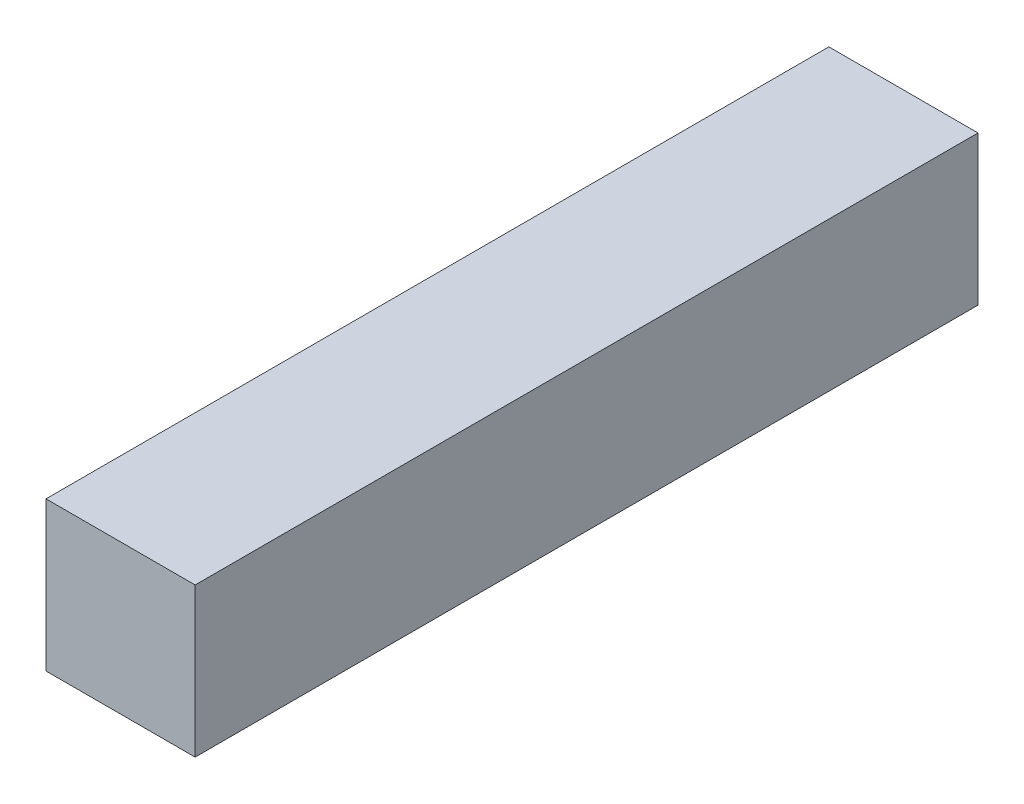
ISO-10303-21;
HEADER;
FILE_DESCRIPTION(('STEP AP214'),'2;1');
FILE_NAME('part.step','',(''),(''),'','','');
FILE_SCHEMA(('AUTOMOTIVE_DESIGN { 1 0 10303 214 1 1 1 1 }'));
ENDSEC;
DATA;
#1=APPLICATION_CONTEXT('core data for automotive mechanical design processes');
#2=APPLICATION_PROTOCOL_DEFINITION('international standard','automotive_design',2000,#1);
#3=PRODUCT_CONTEXT('',#1,'mechanical');
#4=PRODUCT('Part','Part','',(#3));
#5=PRODUCT_RELATED_PRODUCT_CATEGORY('part','',(#4));
#6=PRODUCT_DEFINITION_FORMATION('','',#4);
#7=PRODUCT_DEFINITION_CONTEXT('part definition',#1,'design');
#8=PRODUCT_DEFINITION('design','',#6,#7);
#9=PRODUCT_DEFINITION_SHAPE('','',#8);
#10=(LENGTH_UNIT() NAMED_UNIT(*) SI_UNIT(.MILLI.,.METRE.));
#11=(NAMED_UNIT(*) PLANE_ANGLE_UNIT() SI_UNIT($,.RADIAN.));
#12=(NAMED_UNIT(*) SI_UNIT($,.STERADIAN.) SOLID_ANGLE_UNIT());
#13=UNCERTAINTY_MEASURE_WITH_UNIT(LENGTH_MEASURE(1.E-05),#10,'distance_accuracy_value','');
#14=(GEOMETRIC_REPRESENTATION_CONTEXT(3) GLOBAL_UNCERTAINTY_ASSIGNED_CONTEXT((#13)) GLOBAL_UNIT_ASSIGNED_CONTEXT((#10,
#11,#12)) REPRESENTATION_CONTEXT('',''));
#15=CARTESIAN_POINT('',(0.,0.,0.));
#16=DIRECTION('',(0.,0.,1.));
#17=DIRECTION('',(1.,0.,0.));
#18=AXIS2_PLACEMENT_3D('',#15,#16,#17);
#19=CARTESIAN_POINT('',(2.38125,2.38125,-304.8));
#20=DIRECTION('',(1.,0.,0.));
#21=DIRECTION('',(0.,1.,0.));
#22=AXIS2_PLACEMENT_3D('',#19,#20,#21);
#23=PLANE('',#22);
#24=DIRECTION('',(0.,1.,0.));
#25=VECTOR('',#24,1.);
#26=CARTESIAN_POINT('',(2.38125,-2.38125,-304.8));
#27=LINE('',#26,#25);
#28=CARTESIAN_POINT('',(2.38125,-2.38125,-304.8));
#29=VERTEX_POINT('',#28);
#30=CARTESIAN_POINT('',(2.38125,2.38125,-304.8));
#31=VERTEX_POINT('',#30);
#32=EDGE_CURVE('E55',#29,#31,#27,.T.);
#33=ORIENTED_EDGE('',*,*,#32,.T.);
#34=DIRECTION('',(0.,0.,1.));
#35=VECTOR('',#34,1.);
#36=CARTESIAN_POINT('',(2.38125,2.38125,-304.8));
#37=LINE('',#36,#35);
#38=CARTESIAN_POINT('',(2.38125,2.38125,-279.8));
#39=VERTEX_POINT('',#38);
#40=EDGE_CURVE('E68',#39,#31,#37,.F.);
#41=ORIENTED_EDGE('',*,*,#40,.F.);
#42=DIRECTION('',(0.,1.,0.));
#43=VECTOR('',#42,1.);
#44=CARTESIAN_POINT('',(2.38125,-2.38125,-279.8));
#45=LINE('',#44,#43);
#46=CARTESIAN_POINT('',(2.38125,-2.38125,-279.8));
#47=VERTEX_POINT('',#46);
#48=EDGE_CURVE('E19',#47,#39,#45,.T.);
#49=ORIENTED_EDGE('',*,*,#48,.F.);
#50=DIRECTION('',(0.,0.,-1.));
#51=VECTOR('',#50,1.);
#52=CARTESIAN_POINT('',(2.38125,-2.38125,-304.8));
#53=LINE('',#52,#51);
#54=EDGE_CURVE('E90',#29,#47,#53,.F.);
#55=ORIENTED_EDGE('',*,*,#54,.F.);
#56=EDGE_LOOP('',(#33,#41,#49,#55));
#57=FACE_BOUND('',#56,.T.);
#58=ADVANCED_FACE('F16',(#57),#23,.T.);
#59=CARTESIAN_POINT('',(-2.38125,-2.38125,-279.8));
#60=DIRECTION('',(0.,0.,1.));
#61=DIRECTION('',(1.,0.,0.));
#62=AXIS2_PLACEMENT_3D('',#59,#60,#61);
#63=PLANE('',#62);
#64=ORIENTED_EDGE('',*,*,#48,.T.);
#65=DIRECTION('',(1.,0.,0.));
#66=VECTOR('',#65,1.);
#67=CARTESIAN_POINT('',(-2.38125,2.38125,-279.8));
#68=LINE('',#67,#66);
#69=CARTESIAN_POINT('',(-2.38125,2.38125,-279.8));
#70=VERTEX_POINT('',#69);
#71=EDGE_CURVE('E62',#70,#39,#68,.T.);
#72=ORIENTED_EDGE('',*,*,#71,.F.);
#73=DIRECTION('',(0.,1.,0.));
#74=VECTOR('',#73,1.);
#75=CARTESIAN_POINT('',(-2.38125,2.38125,-279.8));
#76=LINE('',#75,#74);
#77=CARTESIAN_POINT('',(-2.38125,-2.38125,-279.8));
#78=VERTEX_POINT('',#77);
#79=EDGE_CURVE('E93',#78,#70,#76,.T.);
#80=ORIENTED_EDGE('',*,*,#79,.F.);
#81=DIRECTION('',(1.,0.,0.));
#82=VECTOR('',#81,1.);
#83=CARTESIAN_POINT('',(-2.38125,-2.38125,-279.8));
#84=LINE('',#83,#82);
#85=EDGE_CURVE('E65',#47,#78,#84,.F.);
#86=ORIENTED_EDGE('',*,*,#85,.F.);
#87=EDGE_LOOP('',(#64,#72,#80,#86));
#88=FACE_BOUND('',#87,.T.);
#89=ADVANCED_FACE('F60',(#88),#63,.T.);
#90=CARTESIAN_POINT('',(-2.38125,2.38125,-304.8));
#91=DIRECTION('',(0.,1.,0.));
#92=DIRECTION('',(0.,0.,1.));
#93=AXIS2_PLACEMENT_3D('',#90,#91,#92);
#94=PLANE('',#93);
#95=DIRECTION('',(1.,0.,0.));
#96=VECTOR('',#95,1.);
#97=CARTESIAN_POINT('',(-2.38125,2.38125,-304.8));
#98=LINE('',#97,#96);
#99=CARTESIAN_POINT('',(-2.38125,2.38125,-304.8));
#100=VERTEX_POINT('',#99);
#101=EDGE_CURVE('E84',#31,#100,#98,.F.);
#102=ORIENTED_EDGE('',*,*,#101,.T.);
#103=DIRECTION('',(0.,0.,1.));
#104=VECTOR('',#103,1.);
#105=CARTESIAN_POINT('',(-2.38125,2.38125,-304.8));
#106=LINE('',#105,#104);
#107=EDGE_CURVE('E75',#70,#100,#106,.F.);
#108=ORIENTED_EDGE('',*,*,#107,.F.);
#109=ORIENTED_EDGE('',*,*,#71,.T.);
#110=ORIENTED_EDGE('',*,*,#40,.T.);
#111=EDGE_LOOP('',(#102,#108,#109,#110));
#112=FACE_BOUND('',#111,.T.);
#113=ADVANCED_FACE('F73',(#112),#94,.T.);
#114=CARTESIAN_POINT('',(-2.38125,-2.38125,-304.8));
#115=DIRECTION('',(0.,0.,1.));
#116=DIRECTION('',(1.,0.,0.));
#117=AXIS2_PLACEMENT_3D('',#114,#115,#116);
#118=PLANE('',#117);
#119=ORIENTED_EDGE('',*,*,#101,.F.);
#120=ORIENTED_EDGE('',*,*,#32,.F.);
#121=DIRECTION('',(1.,0.,0.));
#122=VECTOR('',#121,1.);
#123=CARTESIAN_POINT('',(-2.38125,-2.38125,-304.8));
#124=LINE('',#123,#122);
#125=CARTESIAN_POINT('',(-2.38125,-2.38125,-304.8));
#126=VERTEX_POINT('',#125);
#127=EDGE_CURVE('E35',#126,#29,#124,.T.);
#128=ORIENTED_EDGE('',*,*,#127,.F.);
#129=DIRECTION('',(0.,1.,0.));
#130=VECTOR('',#129,1.);
#131=CARTESIAN_POINT('',(-2.38125,2.38125,-304.8));
#132=LINE('',#131,#130);
#133=EDGE_CURVE('E26',#100,#126,#132,.F.);
#134=ORIENTED_EDGE('',*,*,#133,.F.);
#135=EDGE_LOOP('',(#119,#120,#128,#134));
#136=FACE_BOUND('',#135,.T.);
#137=ADVANCED_FACE('F101',(#136),#118,.F.);
#138=CARTESIAN_POINT('',(-2.38125,-2.38125,-304.8));
#139=DIRECTION('',(0.,-1.,0.));
#140=DIRECTION('',(0.,0.,-1.));
#141=AXIS2_PLACEMENT_3D('',#138,#139,#140);
#142=PLANE('',#141);
#143=ORIENTED_EDGE('',*,*,#127,.T.);
#144=ORIENTED_EDGE('',*,*,#54,.T.);
#145=ORIENTED_EDGE('',*,*,#85,.T.);
#146=DIRECTION('',(0.,0.,1.));
#147=VECTOR('',#146,1.);
#148=CARTESIAN_POINT('',(-2.38125,-2.38125,-304.8));
#149=LINE('',#148,#147);
#150=EDGE_CURVE('E11',#126,#78,#149,.T.);
#151=ORIENTED_EDGE('',*,*,#150,.F.);
#152=EDGE_LOOP('',(#143,#144,#145,#151));
#153=FACE_BOUND('',#152,.T.);
#154=ADVANCED_FACE('F103',(#153),#142,.T.);
#155=CARTESIAN_POINT('',(-2.38125,2.38125,-304.8));
#156=DIRECTION('',(-1.,0.,0.));
#157=DIRECTION('',(0.,0.,1.));
#158=AXIS2_PLACEMENT_3D('',#155,#156,#157);
#159=PLANE('',#158);
#160=ORIENTED_EDGE('',*,*,#133,.T.);
#161=ORIENTED_EDGE('',*,*,#150,.T.);
#162=ORIENTED_EDGE('',*,*,#79,.T.);
#163=ORIENTED_EDGE('',*,*,#107,.T.);
#164=EDGE_LOOP('',(#160,#161,#162,#163));
#165=FACE_BOUND('',#164,.T.);
#166=ADVANCED_FACE('F100',(#165),#159,.T.);
#167=CLOSED_SHELL('',(#58,#89,#113,#137,#154,#166));
#168=MANIFOLD_SOLID_BREP('B1',#167);
#169=ADVANCED_BREP_SHAPE_REPRESENTATION('',(#18,#168),#14);
#170=SHAPE_DEFINITION_REPRESENTATION(#9,#169);
ENDSEC;
END-ISO-10303-21;
